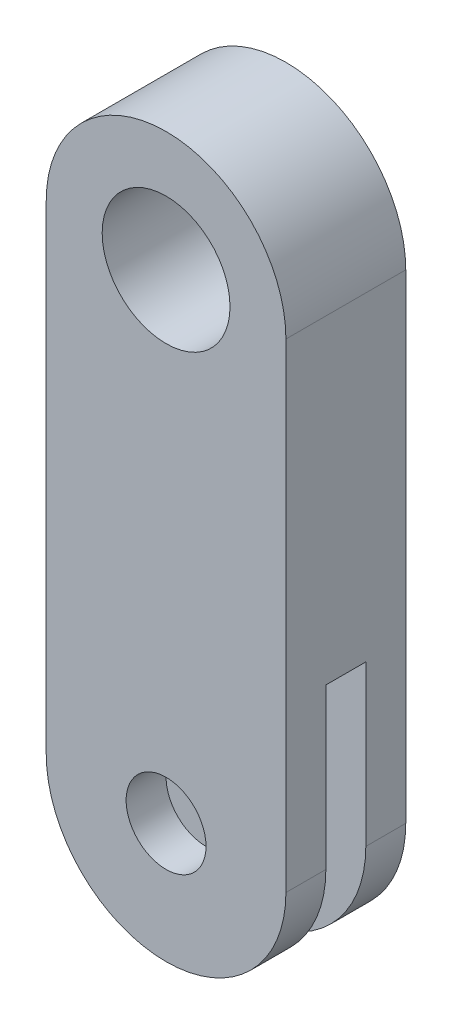
ISO-10303-21;
HEADER;
FILE_DESCRIPTION(('STEP AP214'),'2;1');
FILE_NAME('part.step','',(''),(''),'','','');
FILE_SCHEMA(('AUTOMOTIVE_DESIGN { 1 0 10303 214 1 1 1 1 }'));
ENDSEC;
DATA;
#1=APPLICATION_CONTEXT('core data for automotive mechanical design processes');
#2=APPLICATION_PROTOCOL_DEFINITION('international standard','automotive_design',2000,#1);
#3=PRODUCT_CONTEXT('',#1,'mechanical');
#4=PRODUCT('Part','Part','',(#3));
#5=PRODUCT_RELATED_PRODUCT_CATEGORY('part','',(#4));
#6=PRODUCT_DEFINITION_FORMATION('','',#4);
#7=PRODUCT_DEFINITION_CONTEXT('part definition',#1,'design');
#8=PRODUCT_DEFINITION('design','',#6,#7);
#9=PRODUCT_DEFINITION_SHAPE('','',#8);
#10=(LENGTH_UNIT() NAMED_UNIT(*) SI_UNIT(.MILLI.,.METRE.));
#11=(NAMED_UNIT(*) PLANE_ANGLE_UNIT() SI_UNIT($,.RADIAN.));
#12=(NAMED_UNIT(*) SI_UNIT($,.STERADIAN.) SOLID_ANGLE_UNIT());
#13=UNCERTAINTY_MEASURE_WITH_UNIT(LENGTH_MEASURE(1.E-05),#10,'distance_accuracy_value','');
#14=(GEOMETRIC_REPRESENTATION_CONTEXT(3) GLOBAL_UNCERTAINTY_ASSIGNED_CONTEXT((#13)) GLOBAL_UNIT_ASSIGNED_CONTEXT((#10,
#11,#12)) REPRESENTATION_CONTEXT('',''));
#15=CARTESIAN_POINT('',(0.,0.,0.));
#16=DIRECTION('',(0.,0.,1.));
#17=DIRECTION('',(1.,0.,0.));
#18=AXIS2_PLACEMENT_3D('',#15,#16,#17);
#19=CARTESIAN_POINT('',(-14.3340871670976,80.7958296065914,0.));
#20=DIRECTION('',(0.,0.,1.));
#21=DIRECTION('',(1.,0.,0.));
#22=AXIS2_PLACEMENT_3D('',#19,#20,#21);
#23=PLANE('',#22);
#24=CARTESIAN_POINT('',(-14.3340871670976,20.7958296065914,0.));
#25=DIRECTION('',(0.,0.,1.));
#26=DIRECTION('',(1.,0.,0.));
#27=AXIS2_PLACEMENT_3D('',#24,#25,#26);
#28=CIRCLE('',#27,5.);
#29=CARTESIAN_POINT('',(-9.33408716709757,20.7958296065914,0.));
#30=VERTEX_POINT('',#29);
#31=EDGE_CURVE('E167',#30,#30,#28,.T.);
#32=ORIENTED_EDGE('',*,*,#31,.T.);
#33=EDGE_LOOP('',(#32));
#34=FACE_BOUND('',#33,.T.);
#35=DIRECTION('',(-1.,0.,0.));
#36=VECTOR('',#35,1.);
#37=CARTESIAN_POINT('',(-29.3340871670976,40.7958296065915,0.));
#38=LINE('',#37,#36);
#39=CARTESIAN_POINT('',(0.665912832902425,40.7958296065914,0.));
#40=VERTEX_POINT('',#39);
#41=CARTESIAN_POINT('',(-29.3340871670976,40.7958296065915,0.));
#42=VERTEX_POINT('',#41);
#43=EDGE_CURVE('E53',#40,#42,#38,.T.);
#44=ORIENTED_EDGE('',*,*,#43,.F.);
#45=DIRECTION('',(0.,1.,0.));
#46=VECTOR('',#45,1.);
#47=CARTESIAN_POINT('',(0.665912832902422,20.7958296065914,0.));
#48=LINE('',#47,#46);
#49=CARTESIAN_POINT('',(0.665912832902425,20.7958296065914,0.));
#50=VERTEX_POINT('',#49);
#51=EDGE_CURVE('E175',#50,#40,#48,.T.);
#52=ORIENTED_EDGE('',*,*,#51,.F.);
#53=CARTESIAN_POINT('',(-14.3340871670976,20.7958296065914,0.));
#54=DIRECTION('',(0.,0.,1.));
#55=DIRECTION('',(1.,0.,0.));
#56=AXIS2_PLACEMENT_3D('',#53,#54,#55);
#57=CIRCLE('',#56,15.);
#58=CARTESIAN_POINT('',(-29.3340871670976,20.7958296065914,0.));
#59=VERTEX_POINT('',#58);
#60=EDGE_CURVE('E78',#59,#50,#57,.T.);
#61=ORIENTED_EDGE('',*,*,#60,.F.);
#62=DIRECTION('',(0.,-1.,0.));
#63=VECTOR('',#62,1.);
#64=CARTESIAN_POINT('',(-29.3340871670976,80.7958296065914,0.));
#65=LINE('',#64,#63);
#66=EDGE_CURVE('E171',#42,#59,#65,.T.);
#67=ORIENTED_EDGE('',*,*,#66,.F.);
#68=EDGE_LOOP('',(#44,#52,#61,#67));
#69=FACE_BOUND('',#68,.T.);
#70=ADVANCED_FACE('F38',(#34,#69),#23,.F.);
#71=CARTESIAN_POINT('',(-14.3340871670976,80.7958296065914,5.));
#72=DIRECTION('',(0.,0.,1.));
#73=DIRECTION('',(1.,0.,0.));
#74=AXIS2_PLACEMENT_3D('',#71,#72,#73);
#75=PLANE('',#74);
#76=CARTESIAN_POINT('',(-14.3340871670976,20.7958296065914,5.));
#77=DIRECTION('',(0.,0.,1.));
#78=DIRECTION('',(1.,0.,0.));
#79=AXIS2_PLACEMENT_3D('',#76,#77,#78);
#80=CIRCLE('',#79,5.);
#81=CARTESIAN_POINT('',(-9.33408716709757,20.7958296065914,5.));
#82=VERTEX_POINT('',#81);
#83=EDGE_CURVE('E168',#82,#82,#80,.T.);
#84=ORIENTED_EDGE('',*,*,#83,.F.);
#85=EDGE_LOOP('',(#84));
#86=FACE_BOUND('',#85,.T.);
#87=CARTESIAN_POINT('',(-14.3340871670976,80.7958296065914,5.));
#88=DIRECTION('',(0.,0.,1.));
#89=DIRECTION('',(1.,0.,0.));
#90=AXIS2_PLACEMENT_3D('',#87,#88,#89);
#91=CIRCLE('',#90,15.);
#92=CARTESIAN_POINT('',(0.66591283290243,80.7958296065914,5.));
#93=VERTEX_POINT('',#92);
#94=CARTESIAN_POINT('',(-29.3340871670976,80.7958296065914,5.));
#95=VERTEX_POINT('',#94);
#96=EDGE_CURVE('E118',#93,#95,#91,.T.);
#97=ORIENTED_EDGE('',*,*,#96,.T.);
#98=DIRECTION('',(0.,-1.,0.));
#99=VECTOR('',#98,1.);
#100=CARTESIAN_POINT('',(-29.3340871670976,80.7958296065914,5.));
#101=LINE('',#100,#99);
#102=CARTESIAN_POINT('',(-29.3340871670976,20.7958296065914,5.));
#103=VERTEX_POINT('',#102);
#104=EDGE_CURVE('E85',#95,#103,#101,.T.);
#105=ORIENTED_EDGE('',*,*,#104,.T.);
#106=CARTESIAN_POINT('',(-14.3340871670976,20.7958296065914,5.));
#107=DIRECTION('',(0.,0.,1.));
#108=DIRECTION('',(1.,0.,0.));
#109=AXIS2_PLACEMENT_3D('',#106,#107,#108);
#110=CIRCLE('',#109,15.);
#111=CARTESIAN_POINT('',(0.665912832902425,20.7958296065914,5.));
#112=VERTEX_POINT('',#111);
#113=EDGE_CURVE('E177',#103,#112,#110,.T.);
#114=ORIENTED_EDGE('',*,*,#113,.T.);
#115=DIRECTION('',(0.,1.,0.));
#116=VECTOR('',#115,1.);
#117=CARTESIAN_POINT('',(0.665912832902422,20.7958296065914,5.));
#118=LINE('',#117,#116);
#119=EDGE_CURVE('E62',#112,#93,#118,.T.);
#120=ORIENTED_EDGE('',*,*,#119,.T.);
#121=EDGE_LOOP('',(#97,#105,#114,#120));
#122=FACE_BOUND('',#121,.T.);
#123=CARTESIAN_POINT('',(-14.3340871670976,80.7958296065914,5.));
#124=DIRECTION('',(0.,0.,1.));
#125=DIRECTION('',(1.,0.,0.));
#126=AXIS2_PLACEMENT_3D('',#123,#124,#125);
#127=CIRCLE('',#126,8.);
#128=CARTESIAN_POINT('',(-6.33408716709757,80.7958296065914,5.));
#129=VERTEX_POINT('',#128);
#130=EDGE_CURVE('E164',#129,#129,#127,.T.);
#131=ORIENTED_EDGE('',*,*,#130,.F.);
#132=EDGE_LOOP('',(#131));
#133=FACE_BOUND('',#132,.T.);
#134=ADVANCED_FACE('F203',(#86,#122,#133),#75,.T.);
#135=CARTESIAN_POINT('',(-14.3340871670976,80.7958296065914,5.));
#136=DIRECTION('',(0.,0.,-1.));
#137=DIRECTION('',(-1.,0.,0.));
#138=AXIS2_PLACEMENT_3D('',#135,#136,#137);
#139=CYLINDRICAL_SURFACE('',#138,15.);
#140=DIRECTION('',(0.,0.,-1.));
#141=VECTOR('',#140,1.);
#142=CARTESIAN_POINT('',(0.66591283290243,80.7958296065914,5.));
#143=LINE('',#142,#141);
#144=CARTESIAN_POINT('',(0.66591283290243,80.7958296065914,-10.));
#145=VERTEX_POINT('',#144);
#146=EDGE_CURVE('E113',#93,#145,#143,.T.);
#147=ORIENTED_EDGE('',*,*,#146,.T.);
#148=CARTESIAN_POINT('',(-14.3340871670976,80.7958296065914,-10.));
#149=DIRECTION('',(0.,0.,-1.));
#150=DIRECTION('',(-1.,0.,0.));
#151=AXIS2_PLACEMENT_3D('',#148,#149,#150);
#152=CIRCLE('',#151,15.);
#153=CARTESIAN_POINT('',(-29.3340871670976,80.7958296065914,-10.));
#154=VERTEX_POINT('',#153);
#155=EDGE_CURVE('E117',#154,#145,#152,.T.);
#156=ORIENTED_EDGE('',*,*,#155,.F.);
#157=DIRECTION('',(0.,0.,-1.));
#158=VECTOR('',#157,1.);
#159=CARTESIAN_POINT('',(-29.3340871670976,80.7958296065914,5.));
#160=LINE('',#159,#158);
#161=EDGE_CURVE('E11',#95,#154,#160,.T.);
#162=ORIENTED_EDGE('',*,*,#161,.F.);
#163=ORIENTED_EDGE('',*,*,#96,.F.);
#164=EDGE_LOOP('',(#147,#156,#162,#163));
#165=FACE_BOUND('',#164,.T.);
#166=ADVANCED_FACE('F40',(#165),#139,.T.);
#167=CARTESIAN_POINT('',(-29.3340871670976,80.7958296065914,5.));
#168=DIRECTION('',(1.,0.,0.));
#169=DIRECTION('',(0.,0.,-1.));
#170=AXIS2_PLACEMENT_3D('',#167,#168,#169);
#171=PLANE('',#170);
#172=ORIENTED_EDGE('',*,*,#161,.T.);
#173=DIRECTION('',(0.,1.,0.));
#174=VECTOR('',#173,1.);
#175=CARTESIAN_POINT('',(-29.3340871670976,20.7958296065914,-10.));
#176=LINE('',#175,#174);
#177=CARTESIAN_POINT('',(-29.3340871670976,20.7958296065914,-10.));
#178=VERTEX_POINT('',#177);
#179=EDGE_CURVE('E135',#178,#154,#176,.T.);
#180=ORIENTED_EDGE('',*,*,#179,.F.);
#181=DIRECTION('',(0.,0.,1.));
#182=VECTOR('',#181,1.);
#183=CARTESIAN_POINT('',(-29.3340871670976,20.7958296065914,-10.));
#184=LINE('',#183,#182);
#185=CARTESIAN_POINT('',(-29.3340871670976,20.7958296065914,-5.));
#186=VERTEX_POINT('',#185);
#187=EDGE_CURVE('E147',#178,#186,#184,.T.);
#188=ORIENTED_EDGE('',*,*,#187,.T.);
#189=DIRECTION('',(0.,1.,0.));
#190=VECTOR('',#189,1.);
#191=CARTESIAN_POINT('',(-29.3340871670976,20.7958296065914,-5.));
#192=LINE('',#191,#190);
#193=CARTESIAN_POINT('',(-29.3340871670976,40.7958296065914,-5.));
#194=VERTEX_POINT('',#193);
#195=EDGE_CURVE('E136',#186,#194,#192,.T.);
#196=ORIENTED_EDGE('',*,*,#195,.T.);
#197=DIRECTION('',(0.,0.,1.));
#198=VECTOR('',#197,1.);
#199=CARTESIAN_POINT('',(-29.3340871670976,40.7958296065915,-5.));
#200=LINE('',#199,#198);
#201=EDGE_CURVE('E161',#194,#42,#200,.T.);
#202=ORIENTED_EDGE('',*,*,#201,.T.);
#203=ORIENTED_EDGE('',*,*,#66,.T.);
#204=DIRECTION('',(0.,0.,-1.));
#205=VECTOR('',#204,1.);
#206=CARTESIAN_POINT('',(-29.3340871670976,20.7958296065914,5.));
#207=LINE('',#206,#205);
#208=EDGE_CURVE('E46',#103,#59,#207,.T.);
#209=ORIENTED_EDGE('',*,*,#208,.F.);
#210=ORIENTED_EDGE('',*,*,#104,.F.);
#211=EDGE_LOOP('',(#172,#180,#188,#196,#202,#203,#209,#210));
#212=FACE_BOUND('',#211,.T.);
#213=ADVANCED_FACE('F196',(#212),#171,.F.);
#214=CARTESIAN_POINT('',(-14.3340871670976,20.7958296065914,5.));
#215=DIRECTION('',(0.,0.,-1.));
#216=DIRECTION('',(-1.,0.,0.));
#217=AXIS2_PLACEMENT_3D('',#214,#215,#216);
#218=CYLINDRICAL_SURFACE('',#217,15.);
#219=ORIENTED_EDGE('',*,*,#60,.T.);
#220=DIRECTION('',(0.,0.,-1.));
#221=VECTOR('',#220,1.);
#222=CARTESIAN_POINT('',(0.665912832902425,20.7958296065914,5.));
#223=LINE('',#222,#221);
#224=EDGE_CURVE('E120',#112,#50,#223,.T.);
#225=ORIENTED_EDGE('',*,*,#224,.F.);
#226=ORIENTED_EDGE('',*,*,#113,.F.);
#227=ORIENTED_EDGE('',*,*,#208,.T.);
#228=EDGE_LOOP('',(#219,#225,#226,#227));
#229=FACE_BOUND('',#228,.T.);
#230=ADVANCED_FACE('F184',(#229),#218,.T.);
#231=CARTESIAN_POINT('',(0.665912832902422,20.7958296065914,5.));
#232=DIRECTION('',(-1.,0.,0.));
#233=DIRECTION('',(0.,-1.,0.));
#234=AXIS2_PLACEMENT_3D('',#231,#232,#233);
#235=PLANE('',#234);
#236=ORIENTED_EDGE('',*,*,#51,.T.);
#237=DIRECTION('',(0.,0.,1.));
#238=VECTOR('',#237,1.);
#239=CARTESIAN_POINT('',(0.665912832902425,40.7958296065914,-5.));
#240=LINE('',#239,#238);
#241=CARTESIAN_POINT('',(0.665912832902425,40.7958296065914,-5.));
#242=VERTEX_POINT('',#241);
#243=EDGE_CURVE('E157',#242,#40,#240,.T.);
#244=ORIENTED_EDGE('',*,*,#243,.F.);
#245=DIRECTION('',(0.,-1.,0.));
#246=VECTOR('',#245,1.);
#247=CARTESIAN_POINT('',(0.66591283290243,80.7958296065914,-5.));
#248=LINE('',#247,#246);
#249=CARTESIAN_POINT('',(0.665912832902427,20.7958296065915,-5.));
#250=VERTEX_POINT('',#249);
#251=EDGE_CURVE('E148',#242,#250,#248,.T.);
#252=ORIENTED_EDGE('',*,*,#251,.T.);
#253=DIRECTION('',(0.,0.,1.));
#254=VECTOR('',#253,1.);
#255=CARTESIAN_POINT('',(0.665912832902427,20.7958296065915,-10.));
#256=LINE('',#255,#254);
#257=CARTESIAN_POINT('',(0.665912832902427,20.7958296065915,-10.));
#258=VERTEX_POINT('',#257);
#259=EDGE_CURVE('E126',#258,#250,#256,.T.);
#260=ORIENTED_EDGE('',*,*,#259,.F.);
#261=DIRECTION('',(0.,-1.,0.));
#262=VECTOR('',#261,1.);
#263=CARTESIAN_POINT('',(0.66591283290243,80.7958296065914,-10.));
#264=LINE('',#263,#262);
#265=EDGE_CURVE('E123',#145,#258,#264,.T.);
#266=ORIENTED_EDGE('',*,*,#265,.F.);
#267=ORIENTED_EDGE('',*,*,#146,.F.);
#268=ORIENTED_EDGE('',*,*,#119,.F.);
#269=ORIENTED_EDGE('',*,*,#224,.T.);
#270=EDGE_LOOP('',(#236,#244,#252,#260,#266,#267,#268,#269));
#271=FACE_BOUND('',#270,.T.);
#272=ADVANCED_FACE('F124',(#271),#235,.F.);
#273=CARTESIAN_POINT('',(-14.3340871670976,20.7958296065914,5.));
#274=DIRECTION('',(0.,0.,-1.));
#275=DIRECTION('',(-1.,0.,0.));
#276=AXIS2_PLACEMENT_3D('',#273,#274,#275);
#277=CYLINDRICAL_SURFACE('',#276,5.);
#278=ORIENTED_EDGE('',*,*,#83,.T.);
#279=EDGE_LOOP('',(#278));
#280=FACE_BOUND('',#279,.T.);
#281=ORIENTED_EDGE('',*,*,#31,.F.);
#282=EDGE_LOOP('',(#281));
#283=FACE_BOUND('',#282,.T.);
#284=ADVANCED_FACE('F215',(#280,#283),#277,.F.);
#285=CARTESIAN_POINT('',(-14.3340871670976,80.7958296065914,5.));
#286=DIRECTION('',(0.,0.,-1.));
#287=DIRECTION('',(-1.,0.,0.));
#288=AXIS2_PLACEMENT_3D('',#285,#286,#287);
#289=CYLINDRICAL_SURFACE('',#288,8.);
#290=ORIENTED_EDGE('',*,*,#130,.T.);
#291=EDGE_LOOP('',(#290));
#292=FACE_BOUND('',#291,.T.);
#293=CARTESIAN_POINT('',(-14.3340871670976,80.7958296065914,-10.));
#294=DIRECTION('',(0.,0.,-1.));
#295=DIRECTION('',(-1.,0.,0.));
#296=AXIS2_PLACEMENT_3D('',#293,#294,#295);
#297=CIRCLE('',#296,8.00000000000001);
#298=CARTESIAN_POINT('',(-22.3340871670976,80.7958296065914,-10.));
#299=VERTEX_POINT('',#298);
#300=EDGE_CURVE('E142',#299,#299,#297,.T.);
#301=ORIENTED_EDGE('',*,*,#300,.T.);
#302=EDGE_LOOP('',(#301));
#303=FACE_BOUND('',#302,.T.);
#304=ADVANCED_FACE('F219',(#292,#303),#289,.F.);
#305=CARTESIAN_POINT('',(-29.3340871670976,40.7958296065915,-5.));
#306=DIRECTION('',(0.,1.,0.));
#307=DIRECTION('',(-1.,0.,0.));
#308=AXIS2_PLACEMENT_3D('',#305,#306,#307);
#309=PLANE('',#308);
#310=ORIENTED_EDGE('',*,*,#43,.T.);
#311=ORIENTED_EDGE('',*,*,#201,.F.);
#312=DIRECTION('',(-1.,0.,0.));
#313=VECTOR('',#312,1.);
#314=CARTESIAN_POINT('',(-29.3340871670976,40.7958296065915,-5.));
#315=LINE('',#314,#313);
#316=EDGE_CURVE('E154',#242,#194,#315,.T.);
#317=ORIENTED_EDGE('',*,*,#316,.F.);
#318=ORIENTED_EDGE('',*,*,#243,.T.);
#319=EDGE_LOOP('',(#310,#311,#317,#318));
#320=FACE_BOUND('',#319,.T.);
#321=ADVANCED_FACE('F187',(#320),#309,.F.);
#322=CARTESIAN_POINT('',(-14.3340871670976,80.7958296065914,-5.));
#323=DIRECTION('',(0.,0.,-1.));
#324=DIRECTION('',(-1.,0.,0.));
#325=AXIS2_PLACEMENT_3D('',#322,#323,#324);
#326=PLANE('',#325);
#327=CARTESIAN_POINT('',(-14.3340871670976,20.7958296065914,-5.));
#328=DIRECTION('',(0.,0.,-1.));
#329=DIRECTION('',(-1.,0.,0.));
#330=AXIS2_PLACEMENT_3D('',#327,#328,#329);
#331=CIRCLE('',#330,5.);
#332=CARTESIAN_POINT('',(-19.3340871670976,20.7958296065914,-5.));
#333=VERTEX_POINT('',#332);
#334=EDGE_CURVE('E249',#333,#333,#331,.T.);
#335=ORIENTED_EDGE('',*,*,#334,.T.);
#336=EDGE_LOOP('',(#335));
#337=FACE_BOUND('',#336,.T.);
#338=ORIENTED_EDGE('',*,*,#251,.F.);
#339=ORIENTED_EDGE('',*,*,#316,.T.);
#340=ORIENTED_EDGE('',*,*,#195,.F.);
#341=CARTESIAN_POINT('',(-14.3340871670976,20.7958296065914,-5.));
#342=DIRECTION('',(0.,0.,-1.));
#343=DIRECTION('',(-1.,0.,0.));
#344=AXIS2_PLACEMENT_3D('',#341,#342,#343);
#345=CIRCLE('',#344,15.);
#346=EDGE_CURVE('E139',#250,#186,#345,.T.);
#347=ORIENTED_EDGE('',*,*,#346,.F.);
#348=EDGE_LOOP('',(#338,#339,#340,#347));
#349=FACE_BOUND('',#348,.T.);
#350=ADVANCED_FACE('F192',(#337,#349),#326,.F.);
#351=CARTESIAN_POINT('',(-14.3340871670976,80.7958296065914,-10.));
#352=DIRECTION('',(0.,0.,-1.));
#353=DIRECTION('',(-1.,0.,0.));
#354=AXIS2_PLACEMENT_3D('',#351,#352,#353);
#355=PLANE('',#354);
#356=ORIENTED_EDGE('',*,*,#300,.F.);
#357=EDGE_LOOP('',(#356));
#358=FACE_BOUND('',#357,.T.);
#359=ORIENTED_EDGE('',*,*,#155,.T.);
#360=ORIENTED_EDGE('',*,*,#265,.T.);
#361=CARTESIAN_POINT('',(-14.3340871670976,20.7958296065914,-10.));
#362=DIRECTION('',(0.,0.,-1.));
#363=DIRECTION('',(-1.,0.,0.));
#364=AXIS2_PLACEMENT_3D('',#361,#362,#363);
#365=CIRCLE('',#364,15.);
#366=EDGE_CURVE('E129',#258,#178,#365,.T.);
#367=ORIENTED_EDGE('',*,*,#366,.T.);
#368=ORIENTED_EDGE('',*,*,#179,.T.);
#369=EDGE_LOOP('',(#359,#360,#367,#368));
#370=FACE_BOUND('',#369,.T.);
#371=CARTESIAN_POINT('',(-14.3340871670976,20.7958296065914,-10.));
#372=DIRECTION('',(0.,0.,-1.));
#373=DIRECTION('',(-1.,0.,0.));
#374=AXIS2_PLACEMENT_3D('',#371,#372,#373);
#375=CIRCLE('',#374,5.);
#376=CARTESIAN_POINT('',(-19.3340871670976,20.7958296065914,-10.));
#377=VERTEX_POINT('',#376);
#378=EDGE_CURVE('E246',#377,#377,#375,.T.);
#379=ORIENTED_EDGE('',*,*,#378,.F.);
#380=EDGE_LOOP('',(#379));
#381=FACE_BOUND('',#380,.T.);
#382=ADVANCED_FACE('F132',(#358,#370,#381),#355,.T.);
#383=CARTESIAN_POINT('',(-14.3340871670976,20.7958296065914,-10.));
#384=DIRECTION('',(0.,0.,1.));
#385=DIRECTION('',(1.,0.,0.));
#386=AXIS2_PLACEMENT_3D('',#383,#384,#385);
#387=CYLINDRICAL_SURFACE('',#386,15.);
#388=ORIENTED_EDGE('',*,*,#346,.T.);
#389=ORIENTED_EDGE('',*,*,#187,.F.);
#390=ORIENTED_EDGE('',*,*,#366,.F.);
#391=ORIENTED_EDGE('',*,*,#259,.T.);
#392=EDGE_LOOP('',(#388,#389,#390,#391));
#393=FACE_BOUND('',#392,.T.);
#394=ADVANCED_FACE('F194',(#393),#387,.T.);
#395=CARTESIAN_POINT('',(-14.3340871670976,20.7958296065914,-10.));
#396=DIRECTION('',(0.,0.,1.));
#397=DIRECTION('',(1.,0.,0.));
#398=AXIS2_PLACEMENT_3D('',#395,#396,#397);
#399=CYLINDRICAL_SURFACE('',#398,5.);
#400=ORIENTED_EDGE('',*,*,#378,.T.);
#401=EDGE_LOOP('',(#400));
#402=FACE_BOUND('',#401,.T.);
#403=ORIENTED_EDGE('',*,*,#334,.F.);
#404=EDGE_LOOP('',(#403));
#405=FACE_BOUND('',#404,.T.);
#406=ADVANCED_FACE('F232',(#402,#405),#399,.F.);
#407=CLOSED_SHELL('',(#70,#134,#166,#213,#230,#272,#284,#304,#321,#350,#382,#394,#406));
#408=MANIFOLD_SOLID_BREP('B2',#407);
#409=ADVANCED_BREP_SHAPE_REPRESENTATION('',(#18,#408),#14);
#410=SHAPE_DEFINITION_REPRESENTATION(#9,#409);
ENDSEC;
END-ISO-10303-21;
